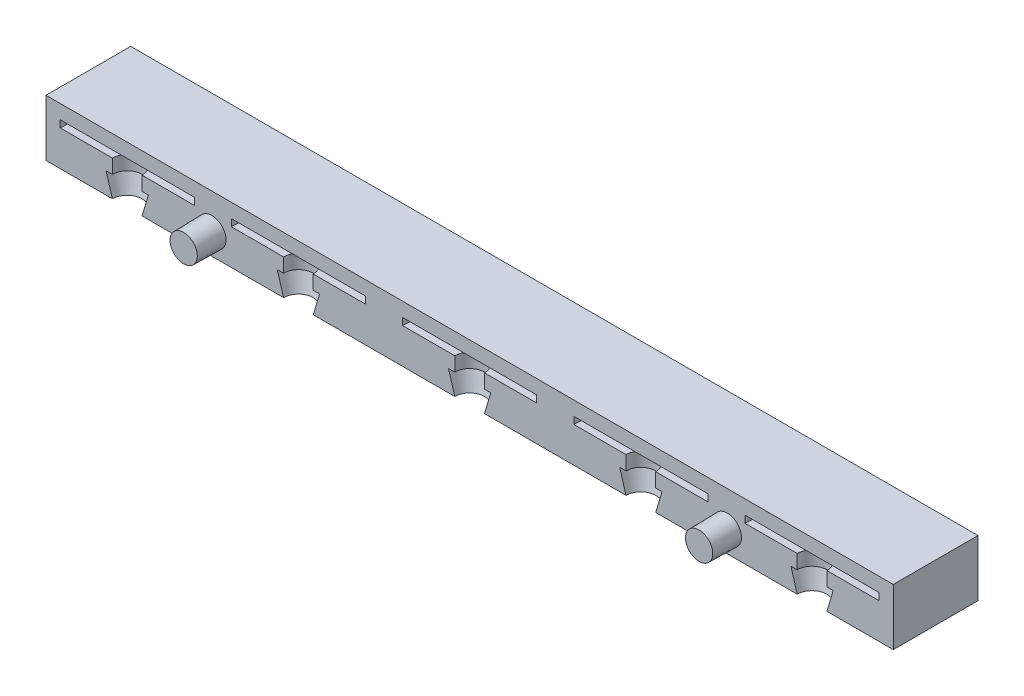
ISO-10303-21;
HEADER;
FILE_DESCRIPTION(('STEP AP214'),'2;1');
FILE_NAME('part.step','',(''),(''),'','','');
FILE_SCHEMA(('AUTOMOTIVE_DESIGN { 1 0 10303 214 1 1 1 1 }'));
ENDSEC;
DATA;
#1=APPLICATION_CONTEXT('core data for automotive mechanical design processes');
#2=APPLICATION_PROTOCOL_DEFINITION('international standard','automotive_design',2000,#1);
#3=PRODUCT_CONTEXT('',#1,'mechanical');
#4=PRODUCT('Part','Part','',(#3));
#5=PRODUCT_RELATED_PRODUCT_CATEGORY('part','',(#4));
#6=PRODUCT_DEFINITION_FORMATION('','',#4);
#7=PRODUCT_DEFINITION_CONTEXT('part definition',#1,'design');
#8=PRODUCT_DEFINITION('design','',#6,#7);
#9=PRODUCT_DEFINITION_SHAPE('','',#8);
#10=(LENGTH_UNIT() NAMED_UNIT(*) SI_UNIT(.MILLI.,.METRE.));
#11=(NAMED_UNIT(*) PLANE_ANGLE_UNIT() SI_UNIT($,.RADIAN.));
#12=(NAMED_UNIT(*) SI_UNIT($,.STERADIAN.) SOLID_ANGLE_UNIT());
#13=UNCERTAINTY_MEASURE_WITH_UNIT(LENGTH_MEASURE(1.E-05),#10,'distance_accuracy_value','');
#14=(GEOMETRIC_REPRESENTATION_CONTEXT(3) GLOBAL_UNCERTAINTY_ASSIGNED_CONTEXT((#13)) GLOBAL_UNIT_ASSIGNED_CONTEXT((#10,
#11,#12)) REPRESENTATION_CONTEXT('',''));
#15=CARTESIAN_POINT('',(0.,0.,0.));
#16=DIRECTION('',(0.,0.,1.));
#17=DIRECTION('',(1.,0.,0.));
#18=AXIS2_PLACEMENT_3D('',#15,#16,#17);
#19=CARTESIAN_POINT('',(0.,0.,-12.));
#20=DIRECTION('',(-1.,0.,0.));
#21=DIRECTION('',(0.,0.,1.));
#22=AXIS2_PLACEMENT_3D('',#19,#20,#21);
#23=PLANE('',#22);
#24=DIRECTION('',(0.,-1.,0.));
#25=VECTOR('',#24,1.);
#26=CARTESIAN_POINT('',(0.,0.,0.));
#27=LINE('',#26,#25);
#28=CARTESIAN_POINT('',(0.,8.,0.));
#29=VERTEX_POINT('',#28);
#30=CARTESIAN_POINT('',(0.,0.,0.));
#31=VERTEX_POINT('',#30);
#32=EDGE_CURVE('E326',#29,#31,#27,.T.);
#33=ORIENTED_EDGE('',*,*,#32,.F.);
#34=DIRECTION('',(0.,0.,1.));
#35=VECTOR('',#34,1.);
#36=CARTESIAN_POINT('',(0.,8.,-12.));
#37=LINE('',#36,#35);
#38=CARTESIAN_POINT('',(0.,8.,-12.));
#39=VERTEX_POINT('',#38);
#40=EDGE_CURVE('E329',#39,#29,#37,.T.);
#41=ORIENTED_EDGE('',*,*,#40,.F.);
#42=DIRECTION('',(0.,-1.,0.));
#43=VECTOR('',#42,1.);
#44=CARTESIAN_POINT('',(0.,0.,-12.));
#45=LINE('',#44,#43);
#46=CARTESIAN_POINT('',(0.,0.,-12.));
#47=VERTEX_POINT('',#46);
#48=EDGE_CURVE('E342',#39,#47,#45,.T.);
#49=ORIENTED_EDGE('',*,*,#48,.T.);
#50=DIRECTION('',(0.,0.,1.));
#51=VECTOR('',#50,1.);
#52=CARTESIAN_POINT('',(0.,0.,-12.));
#53=LINE('',#52,#51);
#54=EDGE_CURVE('E331',#47,#31,#53,.T.);
#55=ORIENTED_EDGE('',*,*,#54,.T.);
#56=EDGE_LOOP('',(#33,#41,#49,#55));
#57=FACE_BOUND('',#56,.T.);
#58=ADVANCED_FACE('F36',(#57),#23,.T.);
#59=CARTESIAN_POINT('',(0.,8.,-12.));
#60=DIRECTION('',(0.,1.,0.));
#61=DIRECTION('',(0.,0.,1.));
#62=AXIS2_PLACEMENT_3D('',#59,#60,#61);
#63=PLANE('',#62);
#64=DIRECTION('',(-1.,0.,0.));
#65=VECTOR('',#64,1.);
#66=CARTESIAN_POINT('',(0.,8.,0.));
#67=LINE('',#66,#65);
#68=CARTESIAN_POINT('',(120.,8.,0.));
#69=VERTEX_POINT('',#68);
#70=EDGE_CURVE('E339',#69,#29,#67,.T.);
#71=ORIENTED_EDGE('',*,*,#70,.F.);
#72=DIRECTION('',(0.,0.,1.));
#73=VECTOR('',#72,1.);
#74=CARTESIAN_POINT('',(120.,8.,-12.));
#75=LINE('',#74,#73);
#76=CARTESIAN_POINT('',(120.,8.,-12.));
#77=VERTEX_POINT('',#76);
#78=EDGE_CURVE('E352',#77,#69,#75,.T.);
#79=ORIENTED_EDGE('',*,*,#78,.F.);
#80=DIRECTION('',(-1.,0.,0.));
#81=VECTOR('',#80,1.);
#82=CARTESIAN_POINT('',(0.,8.,-12.));
#83=LINE('',#82,#81);
#84=EDGE_CURVE('E358',#77,#39,#83,.T.);
#85=ORIENTED_EDGE('',*,*,#84,.T.);
#86=ORIENTED_EDGE('',*,*,#40,.T.);
#87=EDGE_LOOP('',(#71,#79,#85,#86));
#88=FACE_BOUND('',#87,.T.);
#89=ADVANCED_FACE('F317',(#88),#63,.T.);
#90=CARTESIAN_POINT('',(120.,0.,-12.));
#91=DIRECTION('',(1.,0.,0.));
#92=DIRECTION('',(0.,0.,-1.));
#93=AXIS2_PLACEMENT_3D('',#90,#91,#92);
#94=PLANE('',#93);
#95=DIRECTION('',(0.,1.,0.));
#96=VECTOR('',#95,1.);
#97=CARTESIAN_POINT('',(120.,0.,0.));
#98=LINE('',#97,#96);
#99=CARTESIAN_POINT('',(120.,0.,0.));
#100=VERTEX_POINT('',#99);
#101=EDGE_CURVE('E341',#100,#69,#98,.T.);
#102=ORIENTED_EDGE('',*,*,#101,.F.);
#103=DIRECTION('',(0.,0.,1.));
#104=VECTOR('',#103,1.);
#105=CARTESIAN_POINT('',(120.,0.,-12.));
#106=LINE('',#105,#104);
#107=CARTESIAN_POINT('',(120.,0.,-12.));
#108=VERTEX_POINT('',#107);
#109=EDGE_CURVE('E354',#108,#100,#106,.T.);
#110=ORIENTED_EDGE('',*,*,#109,.F.);
#111=DIRECTION('',(0.,1.,0.));
#112=VECTOR('',#111,1.);
#113=CARTESIAN_POINT('',(120.,0.,-12.));
#114=LINE('',#113,#112);
#115=EDGE_CURVE('E547',#108,#77,#114,.T.);
#116=ORIENTED_EDGE('',*,*,#115,.T.);
#117=ORIENTED_EDGE('',*,*,#78,.T.);
#118=EDGE_LOOP('',(#102,#110,#116,#117));
#119=FACE_BOUND('',#118,.T.);
#120=ADVANCED_FACE('F322',(#119),#94,.T.);
#121=CARTESIAN_POINT('',(0.,0.,-12.));
#122=DIRECTION('',(0.,-1.,0.));
#123=DIRECTION('',(0.,0.,-1.));
#124=AXIS2_PLACEMENT_3D('',#121,#122,#123);
#125=PLANE('',#124);
#126=CARTESIAN_POINT('',(108.5,0.,0.));
#127=DIRECTION('',(0.,1.,0.));
#128=DIRECTION('',(-1.,0.,0.));
#129=AXIS2_PLACEMENT_3D('',#126,#127,#128);
#130=CIRCLE('',#129,2.1);
#131=CARTESIAN_POINT('',(110.6,0.,0.));
#132=VERTEX_POINT('',#131);
#133=CARTESIAN_POINT('',(106.4,0.,0.));
#134=VERTEX_POINT('',#133);
#135=EDGE_CURVE('E657',#132,#134,#130,.T.);
#136=ORIENTED_EDGE('',*,*,#135,.T.);
#137=DIRECTION('',(1.,0.,0.));
#138=VECTOR('',#137,1.);
#139=CARTESIAN_POINT('',(0.,0.,0.));
#140=LINE('',#139,#138);
#141=CARTESIAN_POINT('',(86.35,0.,0.));
#142=VERTEX_POINT('',#141);
#143=EDGE_CURVE('E487',#142,#134,#140,.T.);
#144=ORIENTED_EDGE('',*,*,#143,.F.);
#145=CARTESIAN_POINT('',(84.25,0.,0.));
#146=DIRECTION('',(0.,1.,0.));
#147=DIRECTION('',(-1.,0.,0.));
#148=AXIS2_PLACEMENT_3D('',#145,#146,#147);
#149=CIRCLE('',#148,2.1);
#150=CARTESIAN_POINT('',(82.15,0.,0.));
#151=VERTEX_POINT('',#150);
#152=EDGE_CURVE('E480',#142,#151,#149,.T.);
#153=ORIENTED_EDGE('',*,*,#152,.T.);
#154=CARTESIAN_POINT('',(62.1,0.,0.));
#155=VERTEX_POINT('',#154);
#156=EDGE_CURVE('E475',#155,#151,#140,.T.);
#157=ORIENTED_EDGE('',*,*,#156,.F.);
#158=CARTESIAN_POINT('',(60.,0.,0.));
#159=DIRECTION('',(0.,1.,0.));
#160=DIRECTION('',(-1.,0.,0.));
#161=AXIS2_PLACEMENT_3D('',#158,#159,#160);
#162=CIRCLE('',#161,2.1);
#163=CARTESIAN_POINT('',(57.9,0.,0.));
#164=VERTEX_POINT('',#163);
#165=EDGE_CURVE('E508',#155,#164,#162,.T.);
#166=ORIENTED_EDGE('',*,*,#165,.T.);
#167=CARTESIAN_POINT('',(37.85,0.,0.));
#168=VERTEX_POINT('',#167);
#169=EDGE_CURVE('E553',#168,#164,#140,.T.);
#170=ORIENTED_EDGE('',*,*,#169,.F.);
#171=CARTESIAN_POINT('',(35.75,0.,0.));
#172=DIRECTION('',(0.,1.,0.));
#173=DIRECTION('',(-1.,0.,0.));
#174=AXIS2_PLACEMENT_3D('',#171,#172,#173);
#175=CIRCLE('',#174,2.1);
#176=CARTESIAN_POINT('',(33.65,0.,0.));
#177=VERTEX_POINT('',#176);
#178=EDGE_CURVE('E525',#168,#177,#175,.T.);
#179=ORIENTED_EDGE('',*,*,#178,.T.);
#180=CARTESIAN_POINT('',(13.6,0.,0.));
#181=VERTEX_POINT('',#180);
#182=EDGE_CURVE('E551',#181,#177,#140,.T.);
#183=ORIENTED_EDGE('',*,*,#182,.F.);
#184=CARTESIAN_POINT('',(11.5,0.,0.));
#185=DIRECTION('',(0.,1.,0.));
#186=DIRECTION('',(-1.,0.,0.));
#187=AXIS2_PLACEMENT_3D('',#184,#185,#186);
#188=CIRCLE('',#187,2.1);
#189=CARTESIAN_POINT('',(9.4,0.,0.));
#190=VERTEX_POINT('',#189);
#191=EDGE_CURVE('E335',#181,#190,#188,.T.);
#192=ORIENTED_EDGE('',*,*,#191,.T.);
#193=EDGE_CURVE('E346',#31,#190,#140,.T.);
#194=ORIENTED_EDGE('',*,*,#193,.F.);
#195=ORIENTED_EDGE('',*,*,#54,.F.);
#196=DIRECTION('',(1.,0.,0.));
#197=VECTOR('',#196,1.);
#198=CARTESIAN_POINT('',(0.,0.,-12.));
#199=LINE('',#198,#197);
#200=EDGE_CURVE('E344',#47,#108,#199,.T.);
#201=ORIENTED_EDGE('',*,*,#200,.T.);
#202=ORIENTED_EDGE('',*,*,#109,.T.);
#203=EDGE_CURVE('E334',#132,#100,#140,.T.);
#204=ORIENTED_EDGE('',*,*,#203,.F.);
#205=EDGE_LOOP('',(#136,#144,#153,#157,#166,#170,#179,#183,#192,#194,#195,#201,#202,#204));
#206=FACE_BOUND('',#205,.T.);
#207=ADVANCED_FACE('F311',(#206),#125,.T.);
#208=CARTESIAN_POINT('',(0.,0.,-12.));
#209=DIRECTION('',(0.,0.,-1.));
#210=DIRECTION('',(-1.,0.,0.));
#211=AXIS2_PLACEMENT_3D('',#208,#209,#210);
#212=PLANE('',#211);
#213=ORIENTED_EDGE('',*,*,#48,.F.);
#214=ORIENTED_EDGE('',*,*,#84,.F.);
#215=ORIENTED_EDGE('',*,*,#115,.F.);
#216=ORIENTED_EDGE('',*,*,#200,.F.);
#217=EDGE_LOOP('',(#213,#214,#215,#216));
#218=FACE_BOUND('',#217,.T.);
#219=ADVANCED_FACE('F301',(#218),#212,.T.);
#220=CARTESIAN_POINT('',(0.,0.,0.));
#221=DIRECTION('',(0.,0.,-1.));
#222=DIRECTION('',(-1.,0.,0.));
#223=AXIS2_PLACEMENT_3D('',#220,#221,#222);
#224=PLANE('',#223);
#225=CARTESIAN_POINT('',(96.5,3.,0.));
#226=DIRECTION('',(0.,0.,-1.));
#227=DIRECTION('',(-1.,0.,0.));
#228=AXIS2_PLACEMENT_3D('',#225,#226,#227);
#229=CIRCLE('',#228,2.);
#230=CARTESIAN_POINT('',(94.5,3.,0.));
#231=VERTEX_POINT('',#230);
#232=EDGE_CURVE('E12',#231,#231,#229,.F.);
#233=ORIENTED_EDGE('',*,*,#232,.F.);
#234=EDGE_LOOP('',(#233));
#235=FACE_BOUND('',#234,.T.);
#236=CARTESIAN_POINT('',(23.5,3.,0.));
#237=DIRECTION('',(0.,0.,-1.));
#238=DIRECTION('',(-1.,0.,0.));
#239=AXIS2_PLACEMENT_3D('',#236,#237,#238);
#240=CIRCLE('',#239,2.);
#241=CARTESIAN_POINT('',(21.5,3.,0.));
#242=VERTEX_POINT('',#241);
#243=EDGE_CURVE('E43',#242,#242,#240,.F.);
#244=ORIENTED_EDGE('',*,*,#243,.F.);
#245=EDGE_LOOP('',(#244));
#246=FACE_BOUND('',#245,.T.);
#247=ORIENTED_EDGE('',*,*,#143,.T.);
#248=DIRECTION('',(-0.287347885566345,0.957826285221151,0.));
#249=VECTOR('',#248,1.);
#250=CARTESIAN_POINT('',(108.5,-7.00000000000002,0.));
#251=LINE('',#250,#249);
#252=CARTESIAN_POINT('',(105.5,3.,0.));
#253=VERTEX_POINT('',#252);
#254=EDGE_CURVE('E292',#134,#253,#251,.T.);
#255=ORIENTED_EDGE('',*,*,#254,.T.);
#256=DIRECTION('',(1.,0.,0.));
#257=VECTOR('',#256,1.);
#258=CARTESIAN_POINT('',(0.,2.99999999999997,0.));
#259=LINE('',#258,#257);
#260=CARTESIAN_POINT('',(106.4,3.,0.));
#261=VERTEX_POINT('',#260);
#262=EDGE_CURVE('E288',#253,#261,#259,.T.);
#263=ORIENTED_EDGE('',*,*,#262,.T.);
#264=DIRECTION('',(0.,1.,0.));
#265=VECTOR('',#264,1.);
#266=CARTESIAN_POINT('',(106.4,6.,0.));
#267=LINE('',#266,#265);
#268=CARTESIAN_POINT('',(106.4,5.,0.));
#269=VERTEX_POINT('',#268);
#270=EDGE_CURVE('E283',#261,#269,#267,.T.);
#271=ORIENTED_EDGE('',*,*,#270,.T.);
#272=DIRECTION('',(-1.,0.,0.));
#273=VECTOR('',#272,1.);
#274=CARTESIAN_POINT('',(0.,4.99999999999997,0.));
#275=LINE('',#274,#273);
#276=CARTESIAN_POINT('',(99.,4.99999999999999,0.));
#277=VERTEX_POINT('',#276);
#278=EDGE_CURVE('E274',#269,#277,#275,.T.);
#279=ORIENTED_EDGE('',*,*,#278,.T.);
#280=DIRECTION('',(0.,1.,0.));
#281=VECTOR('',#280,1.);
#282=CARTESIAN_POINT('',(99.,6.,0.));
#283=LINE('',#282,#281);
#284=CARTESIAN_POINT('',(99.,6.,0.));
#285=VERTEX_POINT('',#284);
#286=EDGE_CURVE('E265',#277,#285,#283,.T.);
#287=ORIENTED_EDGE('',*,*,#286,.T.);
#288=DIRECTION('',(1.,0.,0.));
#289=VECTOR('',#288,1.);
#290=CARTESIAN_POINT('',(0.,5.99999999999997,0.));
#291=LINE('',#290,#289);
#292=CARTESIAN_POINT('',(118.,6.,0.));
#293=VERTEX_POINT('',#292);
#294=EDGE_CURVE('E254',#285,#293,#291,.T.);
#295=ORIENTED_EDGE('',*,*,#294,.T.);
#296=DIRECTION('',(0.,1.,0.));
#297=VECTOR('',#296,1.);
#298=CARTESIAN_POINT('',(118.,6.,0.));
#299=LINE('',#298,#297);
#300=CARTESIAN_POINT('',(118.,5.,0.));
#301=VERTEX_POINT('',#300);
#302=EDGE_CURVE('E259',#293,#301,#299,.F.);
#303=ORIENTED_EDGE('',*,*,#302,.T.);
#304=CARTESIAN_POINT('',(110.6,5.,0.));
#305=VERTEX_POINT('',#304);
#306=EDGE_CURVE('E276',#301,#305,#275,.T.);
#307=ORIENTED_EDGE('',*,*,#306,.T.);
#308=DIRECTION('',(0.,1.,0.));
#309=VECTOR('',#308,1.);
#310=CARTESIAN_POINT('',(110.6,6.,0.));
#311=LINE('',#310,#309);
#312=CARTESIAN_POINT('',(110.6,3.,0.));
#313=VERTEX_POINT('',#312);
#314=EDGE_CURVE('E280',#305,#313,#311,.F.);
#315=ORIENTED_EDGE('',*,*,#314,.T.);
#316=CARTESIAN_POINT('',(111.5,3.,0.));
#317=VERTEX_POINT('',#316);
#318=EDGE_CURVE('E285',#313,#317,#259,.T.);
#319=ORIENTED_EDGE('',*,*,#318,.T.);
#320=DIRECTION('',(-0.287347885566345,-0.957826285221152,0.));
#321=VECTOR('',#320,1.);
#322=CARTESIAN_POINT('',(108.5,-7.00000000000002,0.));
#323=LINE('',#322,#321);
#324=EDGE_CURVE('E289',#317,#132,#323,.T.);
#325=ORIENTED_EDGE('',*,*,#324,.T.);
#326=ORIENTED_EDGE('',*,*,#203,.T.);
#327=ORIENTED_EDGE('',*,*,#101,.T.);
#328=ORIENTED_EDGE('',*,*,#70,.T.);
#329=ORIENTED_EDGE('',*,*,#32,.T.);
#330=ORIENTED_EDGE('',*,*,#193,.T.);
#331=DIRECTION('',(-0.287347885566345,0.957826285221151,0.));
#332=VECTOR('',#331,1.);
#333=CARTESIAN_POINT('',(11.5,-7.00000000000002,0.));
#334=LINE('',#333,#332);
#335=CARTESIAN_POINT('',(8.5,3.,0.));
#336=VERTEX_POINT('',#335);
#337=EDGE_CURVE('E384',#190,#336,#334,.T.);
#338=ORIENTED_EDGE('',*,*,#337,.T.);
#339=DIRECTION('',(1.,0.,0.));
#340=VECTOR('',#339,1.);
#341=CARTESIAN_POINT('',(0.,3.,0.));
#342=LINE('',#341,#340);
#343=CARTESIAN_POINT('',(9.4,3.,0.));
#344=VERTEX_POINT('',#343);
#345=EDGE_CURVE('E380',#336,#344,#342,.T.);
#346=ORIENTED_EDGE('',*,*,#345,.T.);
#347=DIRECTION('',(0.,1.,0.));
#348=VECTOR('',#347,1.);
#349=CARTESIAN_POINT('',(9.4,6.,0.));
#350=LINE('',#349,#348);
#351=CARTESIAN_POINT('',(9.4,5.,0.));
#352=VERTEX_POINT('',#351);
#353=EDGE_CURVE('E374',#344,#352,#350,.T.);
#354=ORIENTED_EDGE('',*,*,#353,.T.);
#355=DIRECTION('',(-1.,0.,0.));
#356=VECTOR('',#355,1.);
#357=CARTESIAN_POINT('',(0.,4.99999999999999,0.));
#358=LINE('',#357,#356);
#359=CARTESIAN_POINT('',(2.,4.99999999999999,0.));
#360=VERTEX_POINT('',#359);
#361=EDGE_CURVE('E367',#352,#360,#358,.T.);
#362=ORIENTED_EDGE('',*,*,#361,.T.);
#363=DIRECTION('',(0.,1.,0.));
#364=VECTOR('',#363,1.);
#365=CARTESIAN_POINT('',(2.,5.99999999999999,0.));
#366=LINE('',#365,#364);
#367=CARTESIAN_POINT('',(2.,6.,0.));
#368=VERTEX_POINT('',#367);
#369=EDGE_CURVE('E364',#360,#368,#366,.T.);
#370=ORIENTED_EDGE('',*,*,#369,.T.);
#371=DIRECTION('',(1.,0.,0.));
#372=VECTOR('',#371,1.);
#373=CARTESIAN_POINT('',(0.,5.99999999999999,0.));
#374=LINE('',#373,#372);
#375=CARTESIAN_POINT('',(21.,6.,0.));
#376=VERTEX_POINT('',#375);
#377=EDGE_CURVE('E351',#368,#376,#374,.T.);
#378=ORIENTED_EDGE('',*,*,#377,.T.);
#379=DIRECTION('',(0.,1.,0.));
#380=VECTOR('',#379,1.);
#381=CARTESIAN_POINT('',(21.,6.,0.));
#382=LINE('',#381,#380);
#383=CARTESIAN_POINT('',(21.,5.,0.));
#384=VERTEX_POINT('',#383);
#385=EDGE_CURVE('E361',#376,#384,#382,.F.);
#386=ORIENTED_EDGE('',*,*,#385,.T.);
#387=CARTESIAN_POINT('',(13.6,5.,0.));
#388=VERTEX_POINT('',#387);
#389=EDGE_CURVE('E370',#384,#388,#358,.T.);
#390=ORIENTED_EDGE('',*,*,#389,.T.);
#391=DIRECTION('',(0.,1.,0.));
#392=VECTOR('',#391,1.);
#393=CARTESIAN_POINT('',(13.6,6.,0.));
#394=LINE('',#393,#392);
#395=CARTESIAN_POINT('',(13.6,3.,0.));
#396=VERTEX_POINT('',#395);
#397=EDGE_CURVE('E371',#388,#396,#394,.F.);
#398=ORIENTED_EDGE('',*,*,#397,.T.);
#399=CARTESIAN_POINT('',(14.5,3.,0.));
#400=VERTEX_POINT('',#399);
#401=EDGE_CURVE('E377',#396,#400,#342,.T.);
#402=ORIENTED_EDGE('',*,*,#401,.T.);
#403=DIRECTION('',(-0.287347885566345,-0.957826285221152,0.));
#404=VECTOR('',#403,1.);
#405=CARTESIAN_POINT('',(11.5,-7.00000000000002,0.));
#406=LINE('',#405,#404);
#407=EDGE_CURVE('E381',#400,#181,#406,.T.);
#408=ORIENTED_EDGE('',*,*,#407,.T.);
#409=ORIENTED_EDGE('',*,*,#182,.T.);
#410=DIRECTION('',(-0.287347885566345,0.957826285221151,0.));
#411=VECTOR('',#410,1.);
#412=CARTESIAN_POINT('',(35.75,-7.00000000000002,0.));
#413=LINE('',#412,#411);
#414=CARTESIAN_POINT('',(32.75,3.,0.));
#415=VERTEX_POINT('',#414);
#416=EDGE_CURVE('E413',#177,#415,#413,.T.);
#417=ORIENTED_EDGE('',*,*,#416,.T.);
#418=DIRECTION('',(1.,0.,0.));
#419=VECTOR('',#418,1.);
#420=CARTESIAN_POINT('',(0.,2.99999999999999,0.));
#421=LINE('',#420,#419);
#422=CARTESIAN_POINT('',(33.65,3.,0.));
#423=VERTEX_POINT('',#422);
#424=EDGE_CURVE('E409',#415,#423,#421,.T.);
#425=ORIENTED_EDGE('',*,*,#424,.T.);
#426=DIRECTION('',(0.,1.,0.));
#427=VECTOR('',#426,1.);
#428=CARTESIAN_POINT('',(33.65,6.,0.));
#429=LINE('',#428,#427);
#430=CARTESIAN_POINT('',(33.65,5.,0.));
#431=VERTEX_POINT('',#430);
#432=EDGE_CURVE('E403',#423,#431,#429,.T.);
#433=ORIENTED_EDGE('',*,*,#432,.T.);
#434=DIRECTION('',(-1.,0.,0.));
#435=VECTOR('',#434,1.);
#436=CARTESIAN_POINT('',(0.,4.99999999999999,0.));
#437=LINE('',#436,#435);
#438=CARTESIAN_POINT('',(26.25,4.99999999999999,0.));
#439=VERTEX_POINT('',#438);
#440=EDGE_CURVE('E396',#431,#439,#437,.T.);
#441=ORIENTED_EDGE('',*,*,#440,.T.);
#442=DIRECTION('',(0.,1.,0.));
#443=VECTOR('',#442,1.);
#444=CARTESIAN_POINT('',(26.25,5.99999999999999,0.));
#445=LINE('',#444,#443);
#446=CARTESIAN_POINT('',(26.25,6.,0.));
#447=VERTEX_POINT('',#446);
#448=EDGE_CURVE('E393',#439,#447,#445,.T.);
#449=ORIENTED_EDGE('',*,*,#448,.T.);
#450=DIRECTION('',(1.,0.,0.));
#451=VECTOR('',#450,1.);
#452=CARTESIAN_POINT('',(0.,5.99999999999999,0.));
#453=LINE('',#452,#451);
#454=CARTESIAN_POINT('',(45.25,6.,0.));
#455=VERTEX_POINT('',#454);
#456=EDGE_CURVE('E387',#447,#455,#453,.T.);
#457=ORIENTED_EDGE('',*,*,#456,.T.);
#458=DIRECTION('',(0.,1.,0.));
#459=VECTOR('',#458,1.);
#460=CARTESIAN_POINT('',(45.25,6.,0.));
#461=LINE('',#460,#459);
#462=CARTESIAN_POINT('',(45.25,5.,0.));
#463=VERTEX_POINT('',#462);
#464=EDGE_CURVE('E390',#455,#463,#461,.F.);
#465=ORIENTED_EDGE('',*,*,#464,.T.);
#466=CARTESIAN_POINT('',(37.85,5.,0.));
#467=VERTEX_POINT('',#466);
#468=EDGE_CURVE('E399',#463,#467,#437,.T.);
#469=ORIENTED_EDGE('',*,*,#468,.T.);
#470=DIRECTION('',(0.,1.,0.));
#471=VECTOR('',#470,1.);
#472=CARTESIAN_POINT('',(37.85,6.,0.));
#473=LINE('',#472,#471);
#474=CARTESIAN_POINT('',(37.85,3.,0.));
#475=VERTEX_POINT('',#474);
#476=EDGE_CURVE('E400',#467,#475,#473,.F.);
#477=ORIENTED_EDGE('',*,*,#476,.T.);
#478=CARTESIAN_POINT('',(38.75,3.,0.));
#479=VERTEX_POINT('',#478);
#480=EDGE_CURVE('E406',#475,#479,#421,.T.);
#481=ORIENTED_EDGE('',*,*,#480,.T.);
#482=DIRECTION('',(-0.287347885566345,-0.957826285221152,0.));
#483=VECTOR('',#482,1.);
#484=CARTESIAN_POINT('',(35.75,-7.00000000000002,0.));
#485=LINE('',#484,#483);
#486=EDGE_CURVE('E410',#479,#168,#485,.T.);
#487=ORIENTED_EDGE('',*,*,#486,.T.);
#488=ORIENTED_EDGE('',*,*,#169,.T.);
#489=DIRECTION('',(-0.287347885566345,0.957826285221151,0.));
#490=VECTOR('',#489,1.);
#491=CARTESIAN_POINT('',(60.,-7.00000000000002,0.));
#492=LINE('',#491,#490);
#493=CARTESIAN_POINT('',(57.,3.,0.));
#494=VERTEX_POINT('',#493);
#495=EDGE_CURVE('E442',#164,#494,#492,.T.);
#496=ORIENTED_EDGE('',*,*,#495,.T.);
#497=DIRECTION('',(1.,0.,0.));
#498=VECTOR('',#497,1.);
#499=CARTESIAN_POINT('',(0.,2.99999999999998,0.));
#500=LINE('',#499,#498);
#501=CARTESIAN_POINT('',(57.9,3.,0.));
#502=VERTEX_POINT('',#501);
#503=EDGE_CURVE('E438',#494,#502,#500,.T.);
#504=ORIENTED_EDGE('',*,*,#503,.T.);
#505=DIRECTION('',(0.,1.,0.));
#506=VECTOR('',#505,1.);
#507=CARTESIAN_POINT('',(57.9,6.,0.));
#508=LINE('',#507,#506);
#509=CARTESIAN_POINT('',(57.9,5.,0.));
#510=VERTEX_POINT('',#509);
#511=EDGE_CURVE('E432',#502,#510,#508,.T.);
#512=ORIENTED_EDGE('',*,*,#511,.T.);
#513=DIRECTION('',(-1.,0.,0.));
#514=VECTOR('',#513,1.);
#515=CARTESIAN_POINT('',(0.,4.99999999999998,0.));
#516=LINE('',#515,#514);
#517=CARTESIAN_POINT('',(50.5,4.99999999999999,0.));
#518=VERTEX_POINT('',#517);
#519=EDGE_CURVE('E425',#510,#518,#516,.T.);
#520=ORIENTED_EDGE('',*,*,#519,.T.);
#521=DIRECTION('',(0.,1.,0.));
#522=VECTOR('',#521,1.);
#523=CARTESIAN_POINT('',(50.5,6.,0.));
#524=LINE('',#523,#522);
#525=CARTESIAN_POINT('',(50.5,6.,0.));
#526=VERTEX_POINT('',#525);
#527=EDGE_CURVE('E422',#518,#526,#524,.T.);
#528=ORIENTED_EDGE('',*,*,#527,.T.);
#529=DIRECTION('',(1.,0.,0.));
#530=VECTOR('',#529,1.);
#531=CARTESIAN_POINT('',(0.,5.99999999999998,0.));
#532=LINE('',#531,#530);
#533=CARTESIAN_POINT('',(69.5,6.,0.));
#534=VERTEX_POINT('',#533);
#535=EDGE_CURVE('E416',#526,#534,#532,.T.);
#536=ORIENTED_EDGE('',*,*,#535,.T.);
#537=DIRECTION('',(0.,1.,0.));
#538=VECTOR('',#537,1.);
#539=CARTESIAN_POINT('',(69.5,6.,0.));
#540=LINE('',#539,#538);
#541=CARTESIAN_POINT('',(69.5,5.,0.));
#542=VERTEX_POINT('',#541);
#543=EDGE_CURVE('E419',#534,#542,#540,.F.);
#544=ORIENTED_EDGE('',*,*,#543,.T.);
#545=CARTESIAN_POINT('',(62.1,5.,0.));
#546=VERTEX_POINT('',#545);
#547=EDGE_CURVE('E428',#542,#546,#516,.T.);
#548=ORIENTED_EDGE('',*,*,#547,.T.);
#549=DIRECTION('',(0.,1.,0.));
#550=VECTOR('',#549,1.);
#551=CARTESIAN_POINT('',(62.1,6.,0.));
#552=LINE('',#551,#550);
#553=CARTESIAN_POINT('',(62.1,3.,0.));
#554=VERTEX_POINT('',#553);
#555=EDGE_CURVE('E429',#546,#554,#552,.F.);
#556=ORIENTED_EDGE('',*,*,#555,.T.);
#557=CARTESIAN_POINT('',(63.,3.,0.));
#558=VERTEX_POINT('',#557);
#559=EDGE_CURVE('E435',#554,#558,#500,.T.);
#560=ORIENTED_EDGE('',*,*,#559,.T.);
#561=DIRECTION('',(-0.287347885566345,-0.957826285221152,0.));
#562=VECTOR('',#561,1.);
#563=CARTESIAN_POINT('',(60.,-7.00000000000002,0.));
#564=LINE('',#563,#562);
#565=EDGE_CURVE('E439',#558,#155,#564,.T.);
#566=ORIENTED_EDGE('',*,*,#565,.T.);
#567=ORIENTED_EDGE('',*,*,#156,.T.);
#568=DIRECTION('',(-0.287347885566345,0.957826285221151,0.));
#569=VECTOR('',#568,1.);
#570=CARTESIAN_POINT('',(84.25,-7.00000000000002,0.));
#571=LINE('',#570,#569);
#572=CARTESIAN_POINT('',(81.25,3.,0.));
#573=VERTEX_POINT('',#572);
#574=EDGE_CURVE('E260',#151,#573,#571,.T.);
#575=ORIENTED_EDGE('',*,*,#574,.T.);
#576=DIRECTION('',(1.,0.,0.));
#577=VECTOR('',#576,1.);
#578=CARTESIAN_POINT('',(0.,2.99999999999998,0.));
#579=LINE('',#578,#577);
#580=CARTESIAN_POINT('',(82.15,3.,0.));
#581=VERTEX_POINT('',#580);
#582=EDGE_CURVE('E467',#573,#581,#579,.T.);
#583=ORIENTED_EDGE('',*,*,#582,.T.);
#584=DIRECTION('',(0.,1.,0.));
#585=VECTOR('',#584,1.);
#586=CARTESIAN_POINT('',(82.15,6.,0.));
#587=LINE('',#586,#585);
#588=CARTESIAN_POINT('',(82.15,5.,0.));
#589=VERTEX_POINT('',#588);
#590=EDGE_CURVE('E461',#581,#589,#587,.T.);
#591=ORIENTED_EDGE('',*,*,#590,.T.);
#592=DIRECTION('',(-1.,0.,0.));
#593=VECTOR('',#592,1.);
#594=CARTESIAN_POINT('',(0.,4.99999999999998,0.));
#595=LINE('',#594,#593);
#596=CARTESIAN_POINT('',(74.75,4.99999999999999,0.));
#597=VERTEX_POINT('',#596);
#598=EDGE_CURVE('E454',#589,#597,#595,.T.);
#599=ORIENTED_EDGE('',*,*,#598,.T.);
#600=DIRECTION('',(0.,1.,0.));
#601=VECTOR('',#600,1.);
#602=CARTESIAN_POINT('',(74.75,6.,0.));
#603=LINE('',#602,#601);
#604=CARTESIAN_POINT('',(74.75,6.,0.));
#605=VERTEX_POINT('',#604);
#606=EDGE_CURVE('E451',#597,#605,#603,.T.);
#607=ORIENTED_EDGE('',*,*,#606,.T.);
#608=DIRECTION('',(1.,0.,0.));
#609=VECTOR('',#608,1.);
#610=CARTESIAN_POINT('',(0.,5.99999999999998,0.));
#611=LINE('',#610,#609);
#612=CARTESIAN_POINT('',(93.75,6.,0.));
#613=VERTEX_POINT('',#612);
#614=EDGE_CURVE('E445',#605,#613,#611,.T.);
#615=ORIENTED_EDGE('',*,*,#614,.T.);
#616=DIRECTION('',(0.,1.,0.));
#617=VECTOR('',#616,1.);
#618=CARTESIAN_POINT('',(93.75,6.,0.));
#619=LINE('',#618,#617);
#620=CARTESIAN_POINT('',(93.75,5.,0.));
#621=VERTEX_POINT('',#620);
#622=EDGE_CURVE('E448',#613,#621,#619,.F.);
#623=ORIENTED_EDGE('',*,*,#622,.T.);
#624=CARTESIAN_POINT('',(86.35,5.,0.));
#625=VERTEX_POINT('',#624);
#626=EDGE_CURVE('E457',#621,#625,#595,.T.);
#627=ORIENTED_EDGE('',*,*,#626,.T.);
#628=DIRECTION('',(0.,1.,0.));
#629=VECTOR('',#628,1.);
#630=CARTESIAN_POINT('',(86.35,6.,0.));
#631=LINE('',#630,#629);
#632=CARTESIAN_POINT('',(86.35,3.,0.));
#633=VERTEX_POINT('',#632);
#634=EDGE_CURVE('E458',#625,#633,#631,.F.);
#635=ORIENTED_EDGE('',*,*,#634,.T.);
#636=CARTESIAN_POINT('',(87.25,3.,0.));
#637=VERTEX_POINT('',#636);
#638=EDGE_CURVE('E464',#633,#637,#579,.T.);
#639=ORIENTED_EDGE('',*,*,#638,.T.);
#640=DIRECTION('',(-0.287347885566345,-0.957826285221152,0.));
#641=VECTOR('',#640,1.);
#642=CARTESIAN_POINT('',(84.25,-7.00000000000002,0.));
#643=LINE('',#642,#641);
#644=EDGE_CURVE('E468',#637,#142,#643,.T.);
#645=ORIENTED_EDGE('',*,*,#644,.T.);
#646=EDGE_LOOP('',(#247,#255,#263,#271,#279,#287,#295,#303,#307,#315,#319,#325,#326,#327,#328,
#329,#330,#338,#346,#354,#362,#370,#378,#386,#390,#398,#402,#408,#409,#417,#425,#433,#441,#449,
#457,#465,#469,#477,#481,#487,#488,#496,#504,#512,#520,#528,#536,#544,#548,#556,#560,#566,#567,
#575,#583,#591,#599,#607,#615,#623,#627,#635,#639,#645));
#647=FACE_BOUND('',#646,.T.);
#648=ADVANCED_FACE('F272',(#235,#246,#647),#224,.F.);
#649=CARTESIAN_POINT('',(11.5,3.,0.));
#650=DIRECTION('',(0.,1.,0.));
#651=DIRECTION('',(-1.,0.,0.));
#652=AXIS2_PLACEMENT_3D('',#649,#650,#651);
#653=CONICAL_SURFACE('',#652,3.,0.291456794477867);
#654=ORIENTED_EDGE('',*,*,#191,.F.);
#655=ORIENTED_EDGE('',*,*,#407,.F.);
#656=CARTESIAN_POINT('',(11.5,3.,0.));
#657=DIRECTION('',(0.,1.,0.));
#658=DIRECTION('',(-1.,0.,0.));
#659=AXIS2_PLACEMENT_3D('',#656,#657,#658);
#660=CIRCLE('',#659,3.);
#661=EDGE_CURVE('E540',#400,#336,#660,.T.);
#662=ORIENTED_EDGE('',*,*,#661,.T.);
#663=ORIENTED_EDGE('',*,*,#337,.F.);
#664=EDGE_LOOP('',(#654,#655,#662,#663));
#665=FACE_BOUND('',#664,.T.);
#666=ADVANCED_FACE('F300',(#665),#653,.F.);
#667=CARTESIAN_POINT('',(8.5,3.,0.));
#668=DIRECTION('',(0.,1.,0.));
#669=DIRECTION('',(-1.,0.,0.));
#670=AXIS2_PLACEMENT_3D('',#667,#668,#669);
#671=PLANE('',#670);
#672=ORIENTED_EDGE('',*,*,#661,.F.);
#673=ORIENTED_EDGE('',*,*,#401,.F.);
#674=CARTESIAN_POINT('',(11.5,3.,0.));
#675=DIRECTION('',(0.,1.,0.));
#676=DIRECTION('',(-1.,0.,0.));
#677=AXIS2_PLACEMENT_3D('',#674,#675,#676);
#678=CIRCLE('',#677,2.1);
#679=EDGE_CURVE('E537',#396,#344,#678,.T.);
#680=ORIENTED_EDGE('',*,*,#679,.T.);
#681=ORIENTED_EDGE('',*,*,#345,.F.);
#682=EDGE_LOOP('',(#672,#673,#680,#681));
#683=FACE_BOUND('',#682,.T.);
#684=ADVANCED_FACE('F308',(#683),#671,.F.);
#685=CARTESIAN_POINT('',(11.5,6.,0.));
#686=DIRECTION('',(0.,1.,0.));
#687=DIRECTION('',(-1.,0.,0.));
#688=AXIS2_PLACEMENT_3D('',#685,#686,#687);
#689=CYLINDRICAL_SURFACE('',#688,2.1);
#690=ORIENTED_EDGE('',*,*,#679,.F.);
#691=ORIENTED_EDGE('',*,*,#397,.F.);
#692=CARTESIAN_POINT('',(11.5,5.,0.));
#693=DIRECTION('',(0.,1.,0.));
#694=DIRECTION('',(-1.,0.,0.));
#695=AXIS2_PLACEMENT_3D('',#692,#693,#694);
#696=CIRCLE('',#695,2.1);
#697=EDGE_CURVE('E534',#388,#352,#696,.T.);
#698=ORIENTED_EDGE('',*,*,#697,.T.);
#699=ORIENTED_EDGE('',*,*,#353,.F.);
#700=EDGE_LOOP('',(#690,#691,#698,#699));
#701=FACE_BOUND('',#700,.T.);
#702=ADVANCED_FACE('F631',(#701),#689,.F.);
#703=CARTESIAN_POINT('',(9.4,5.,0.));
#704=DIRECTION('',(0.,-1.,0.));
#705=DIRECTION('',(1.,0.,0.));
#706=AXIS2_PLACEMENT_3D('',#703,#704,#705);
#707=PLANE('',#706);
#708=CARTESIAN_POINT('',(11.5,4.99999999999999,0.));
#709=DIRECTION('',(0.,1.,0.));
#710=DIRECTION('',(-1.,0.,0.));
#711=AXIS2_PLACEMENT_3D('',#708,#709,#710);
#712=CIRCLE('',#711,9.5);
#713=EDGE_CURVE('E531',#384,#360,#712,.T.);
#714=ORIENTED_EDGE('',*,*,#713,.T.);
#715=ORIENTED_EDGE('',*,*,#361,.F.);
#716=ORIENTED_EDGE('',*,*,#697,.F.);
#717=ORIENTED_EDGE('',*,*,#389,.F.);
#718=EDGE_LOOP('',(#714,#715,#716,#717));
#719=FACE_BOUND('',#718,.T.);
#720=ADVANCED_FACE('F627',(#719),#707,.F.);
#721=CARTESIAN_POINT('',(11.5,6.,0.));
#722=DIRECTION('',(0.,1.,0.));
#723=DIRECTION('',(-1.,0.,0.));
#724=AXIS2_PLACEMENT_3D('',#721,#722,#723);
#725=CYLINDRICAL_SURFACE('',#724,9.5);
#726=ORIENTED_EDGE('',*,*,#713,.F.);
#727=ORIENTED_EDGE('',*,*,#385,.F.);
#728=CARTESIAN_POINT('',(11.5,6.,0.));
#729=DIRECTION('',(0.,1.,0.));
#730=DIRECTION('',(-1.,0.,0.));
#731=AXIS2_PLACEMENT_3D('',#728,#729,#730);
#732=CIRCLE('',#731,9.5);
#733=EDGE_CURVE('E528',#376,#368,#732,.T.);
#734=ORIENTED_EDGE('',*,*,#733,.T.);
#735=ORIENTED_EDGE('',*,*,#369,.F.);
#736=EDGE_LOOP('',(#726,#727,#734,#735));
#737=FACE_BOUND('',#736,.T.);
#738=ADVANCED_FACE('F623',(#737),#725,.F.);
#739=CARTESIAN_POINT('',(2.,6.,0.));
#740=DIRECTION('',(0.,1.,0.));
#741=DIRECTION('',(-1.,0.,0.));
#742=AXIS2_PLACEMENT_3D('',#739,#740,#741);
#743=PLANE('',#742);
#744=ORIENTED_EDGE('',*,*,#733,.F.);
#745=ORIENTED_EDGE('',*,*,#377,.F.);
#746=EDGE_LOOP('',(#744,#745));
#747=FACE_BOUND('',#746,.T.);
#748=ADVANCED_FACE('F619',(#747),#743,.F.);
#749=CARTESIAN_POINT('',(35.75,3.,0.));
#750=DIRECTION('',(0.,1.,0.));
#751=DIRECTION('',(-1.,0.,0.));
#752=AXIS2_PLACEMENT_3D('',#749,#750,#751);
#753=CONICAL_SURFACE('',#752,3.,0.291456794477867);
#754=ORIENTED_EDGE('',*,*,#178,.F.);
#755=ORIENTED_EDGE('',*,*,#486,.F.);
#756=CARTESIAN_POINT('',(35.75,3.,0.));
#757=DIRECTION('',(0.,1.,0.));
#758=DIRECTION('',(-1.,0.,0.));
#759=AXIS2_PLACEMENT_3D('',#756,#757,#758);
#760=CIRCLE('',#759,3.);
#761=EDGE_CURVE('E522',#479,#415,#760,.T.);
#762=ORIENTED_EDGE('',*,*,#761,.T.);
#763=ORIENTED_EDGE('',*,*,#416,.F.);
#764=EDGE_LOOP('',(#754,#755,#762,#763));
#765=FACE_BOUND('',#764,.T.);
#766=ADVANCED_FACE('F615',(#765),#753,.F.);
#767=CARTESIAN_POINT('',(32.75,3.,0.));
#768=DIRECTION('',(0.,1.,0.));
#769=DIRECTION('',(-1.,0.,0.));
#770=AXIS2_PLACEMENT_3D('',#767,#768,#769);
#771=PLANE('',#770);
#772=ORIENTED_EDGE('',*,*,#761,.F.);
#773=ORIENTED_EDGE('',*,*,#480,.F.);
#774=CARTESIAN_POINT('',(35.75,3.,0.));
#775=DIRECTION('',(0.,1.,0.));
#776=DIRECTION('',(-1.,0.,0.));
#777=AXIS2_PLACEMENT_3D('',#774,#775,#776);
#778=CIRCLE('',#777,2.1);
#779=EDGE_CURVE('E519',#475,#423,#778,.T.);
#780=ORIENTED_EDGE('',*,*,#779,.T.);
#781=ORIENTED_EDGE('',*,*,#424,.F.);
#782=EDGE_LOOP('',(#772,#773,#780,#781));
#783=FACE_BOUND('',#782,.T.);
#784=ADVANCED_FACE('F611',(#783),#771,.F.);
#785=CARTESIAN_POINT('',(35.75,6.,0.));
#786=DIRECTION('',(0.,1.,0.));
#787=DIRECTION('',(-1.,0.,0.));
#788=AXIS2_PLACEMENT_3D('',#785,#786,#787);
#789=CYLINDRICAL_SURFACE('',#788,2.1);
#790=ORIENTED_EDGE('',*,*,#779,.F.);
#791=ORIENTED_EDGE('',*,*,#476,.F.);
#792=CARTESIAN_POINT('',(35.75,5.,0.));
#793=DIRECTION('',(0.,1.,0.));
#794=DIRECTION('',(-1.,0.,0.));
#795=AXIS2_PLACEMENT_3D('',#792,#793,#794);
#796=CIRCLE('',#795,2.1);
#797=EDGE_CURVE('E516',#467,#431,#796,.T.);
#798=ORIENTED_EDGE('',*,*,#797,.T.);
#799=ORIENTED_EDGE('',*,*,#432,.F.);
#800=EDGE_LOOP('',(#790,#791,#798,#799));
#801=FACE_BOUND('',#800,.T.);
#802=ADVANCED_FACE('F607',(#801),#789,.F.);
#803=CARTESIAN_POINT('',(33.65,5.,0.));
#804=DIRECTION('',(0.,-1.,0.));
#805=DIRECTION('',(1.,0.,0.));
#806=AXIS2_PLACEMENT_3D('',#803,#804,#805);
#807=PLANE('',#806);
#808=CARTESIAN_POINT('',(35.75,4.99999999999999,0.));
#809=DIRECTION('',(0.,1.,0.));
#810=DIRECTION('',(-1.,0.,0.));
#811=AXIS2_PLACEMENT_3D('',#808,#809,#810);
#812=CIRCLE('',#811,9.5);
#813=EDGE_CURVE('E513',#463,#439,#812,.T.);
#814=ORIENTED_EDGE('',*,*,#813,.T.);
#815=ORIENTED_EDGE('',*,*,#440,.F.);
#816=ORIENTED_EDGE('',*,*,#797,.F.);
#817=ORIENTED_EDGE('',*,*,#468,.F.);
#818=EDGE_LOOP('',(#814,#815,#816,#817));
#819=FACE_BOUND('',#818,.T.);
#820=ADVANCED_FACE('F603',(#819),#807,.F.);
#821=CARTESIAN_POINT('',(35.75,6.,0.));
#822=DIRECTION('',(0.,1.,0.));
#823=DIRECTION('',(-1.,0.,0.));
#824=AXIS2_PLACEMENT_3D('',#821,#822,#823);
#825=CYLINDRICAL_SURFACE('',#824,9.5);
#826=ORIENTED_EDGE('',*,*,#813,.F.);
#827=ORIENTED_EDGE('',*,*,#464,.F.);
#828=CARTESIAN_POINT('',(35.75,6.,0.));
#829=DIRECTION('',(0.,1.,0.));
#830=DIRECTION('',(-1.,0.,0.));
#831=AXIS2_PLACEMENT_3D('',#828,#829,#830);
#832=CIRCLE('',#831,9.5);
#833=EDGE_CURVE('E510',#455,#447,#832,.T.);
#834=ORIENTED_EDGE('',*,*,#833,.T.);
#835=ORIENTED_EDGE('',*,*,#448,.F.);
#836=EDGE_LOOP('',(#826,#827,#834,#835));
#837=FACE_BOUND('',#836,.T.);
#838=ADVANCED_FACE('F599',(#837),#825,.F.);
#839=CARTESIAN_POINT('',(26.25,6.,0.));
#840=DIRECTION('',(0.,1.,0.));
#841=DIRECTION('',(-1.,0.,0.));
#842=AXIS2_PLACEMENT_3D('',#839,#840,#841);
#843=PLANE('',#842);
#844=ORIENTED_EDGE('',*,*,#833,.F.);
#845=ORIENTED_EDGE('',*,*,#456,.F.);
#846=EDGE_LOOP('',(#844,#845));
#847=FACE_BOUND('',#846,.T.);
#848=ADVANCED_FACE('F596',(#847),#843,.F.);
#849=CARTESIAN_POINT('',(60.,3.,0.));
#850=DIRECTION('',(0.,1.,0.));
#851=DIRECTION('',(-1.,0.,0.));
#852=AXIS2_PLACEMENT_3D('',#849,#850,#851);
#853=CONICAL_SURFACE('',#852,3.,0.291456794477867);
#854=ORIENTED_EDGE('',*,*,#165,.F.);
#855=ORIENTED_EDGE('',*,*,#565,.F.);
#856=CARTESIAN_POINT('',(60.,3.,0.));
#857=DIRECTION('',(0.,1.,0.));
#858=DIRECTION('',(-1.,0.,0.));
#859=AXIS2_PLACEMENT_3D('',#856,#857,#858);
#860=CIRCLE('',#859,3.);
#861=EDGE_CURVE('E505',#558,#494,#860,.T.);
#862=ORIENTED_EDGE('',*,*,#861,.T.);
#863=ORIENTED_EDGE('',*,*,#495,.F.);
#864=EDGE_LOOP('',(#854,#855,#862,#863));
#865=FACE_BOUND('',#864,.T.);
#866=ADVANCED_FACE('F560',(#865),#853,.F.);
#867=CARTESIAN_POINT('',(57.,3.,0.));
#868=DIRECTION('',(0.,1.,0.));
#869=DIRECTION('',(-1.,0.,0.));
#870=AXIS2_PLACEMENT_3D('',#867,#868,#869);
#871=PLANE('',#870);
#872=ORIENTED_EDGE('',*,*,#861,.F.);
#873=ORIENTED_EDGE('',*,*,#559,.F.);
#874=CARTESIAN_POINT('',(60.,3.,0.));
#875=DIRECTION('',(0.,1.,0.));
#876=DIRECTION('',(-1.,0.,0.));
#877=AXIS2_PLACEMENT_3D('',#874,#875,#876);
#878=CIRCLE('',#877,2.1);
#879=EDGE_CURVE('E502',#554,#502,#878,.T.);
#880=ORIENTED_EDGE('',*,*,#879,.T.);
#881=ORIENTED_EDGE('',*,*,#503,.F.);
#882=EDGE_LOOP('',(#872,#873,#880,#881));
#883=FACE_BOUND('',#882,.T.);
#884=ADVANCED_FACE('F565',(#883),#871,.F.);
#885=CARTESIAN_POINT('',(60.,6.,0.));
#886=DIRECTION('',(0.,1.,0.));
#887=DIRECTION('',(-1.,0.,0.));
#888=AXIS2_PLACEMENT_3D('',#885,#886,#887);
#889=CYLINDRICAL_SURFACE('',#888,2.1);
#890=ORIENTED_EDGE('',*,*,#879,.F.);
#891=ORIENTED_EDGE('',*,*,#555,.F.);
#892=CARTESIAN_POINT('',(60.,5.,0.));
#893=DIRECTION('',(0.,1.,0.));
#894=DIRECTION('',(-1.,0.,0.));
#895=AXIS2_PLACEMENT_3D('',#892,#893,#894);
#896=CIRCLE('',#895,2.1);
#897=EDGE_CURVE('E499',#546,#510,#896,.T.);
#898=ORIENTED_EDGE('',*,*,#897,.T.);
#899=ORIENTED_EDGE('',*,*,#511,.F.);
#900=EDGE_LOOP('',(#890,#891,#898,#899));
#901=FACE_BOUND('',#900,.T.);
#902=ADVANCED_FACE('F567',(#901),#889,.F.);
#903=CARTESIAN_POINT('',(57.9,5.,0.));
#904=DIRECTION('',(0.,-1.,0.));
#905=DIRECTION('',(1.,0.,0.));
#906=AXIS2_PLACEMENT_3D('',#903,#904,#905);
#907=PLANE('',#906);
#908=CARTESIAN_POINT('',(60.,5.,0.));
#909=DIRECTION('',(0.,1.,0.));
#910=DIRECTION('',(-1.,0.,0.));
#911=AXIS2_PLACEMENT_3D('',#908,#909,#910);
#912=CIRCLE('',#911,9.5);
#913=EDGE_CURVE('E491',#542,#518,#912,.T.);
#914=ORIENTED_EDGE('',*,*,#913,.T.);
#915=ORIENTED_EDGE('',*,*,#519,.F.);
#916=ORIENTED_EDGE('',*,*,#897,.F.);
#917=ORIENTED_EDGE('',*,*,#547,.F.);
#918=EDGE_LOOP('',(#914,#915,#916,#917));
#919=FACE_BOUND('',#918,.T.);
#920=ADVANCED_FACE('F570',(#919),#907,.F.);
#921=CARTESIAN_POINT('',(60.,6.,0.));
#922=DIRECTION('',(0.,1.,0.));
#923=DIRECTION('',(-1.,0.,0.));
#924=AXIS2_PLACEMENT_3D('',#921,#922,#923);
#925=CYLINDRICAL_SURFACE('',#924,9.5);
#926=ORIENTED_EDGE('',*,*,#913,.F.);
#927=ORIENTED_EDGE('',*,*,#543,.F.);
#928=CARTESIAN_POINT('',(60.,6.,0.));
#929=DIRECTION('',(0.,1.,0.));
#930=DIRECTION('',(-1.,0.,0.));
#931=AXIS2_PLACEMENT_3D('',#928,#929,#930);
#932=CIRCLE('',#931,9.5);
#933=EDGE_CURVE('E488',#534,#526,#932,.T.);
#934=ORIENTED_EDGE('',*,*,#933,.T.);
#935=ORIENTED_EDGE('',*,*,#527,.F.);
#936=EDGE_LOOP('',(#926,#927,#934,#935));
#937=FACE_BOUND('',#936,.T.);
#938=ADVANCED_FACE('F574',(#937),#925,.F.);
#939=CARTESIAN_POINT('',(50.5,6.,0.));
#940=DIRECTION('',(0.,1.,0.));
#941=DIRECTION('',(-1.,0.,0.));
#942=AXIS2_PLACEMENT_3D('',#939,#940,#941);
#943=PLANE('',#942);
#944=ORIENTED_EDGE('',*,*,#933,.F.);
#945=ORIENTED_EDGE('',*,*,#535,.F.);
#946=EDGE_LOOP('',(#944,#945));
#947=FACE_BOUND('',#946,.T.);
#948=ADVANCED_FACE('F576',(#947),#943,.F.);
#949=CARTESIAN_POINT('',(84.25,3.,0.));
#950=DIRECTION('',(0.,1.,0.));
#951=DIRECTION('',(-1.,0.,0.));
#952=AXIS2_PLACEMENT_3D('',#949,#950,#951);
#953=CONICAL_SURFACE('',#952,3.,0.291456794477867);
#954=ORIENTED_EDGE('',*,*,#152,.F.);
#955=ORIENTED_EDGE('',*,*,#644,.F.);
#956=CARTESIAN_POINT('',(84.25,3.,0.));
#957=DIRECTION('',(0.,1.,0.));
#958=DIRECTION('',(-1.,0.,0.));
#959=AXIS2_PLACEMENT_3D('',#956,#957,#958);
#960=CIRCLE('',#959,3.);
#961=EDGE_CURVE('E482',#637,#573,#960,.T.);
#962=ORIENTED_EDGE('',*,*,#961,.T.);
#963=ORIENTED_EDGE('',*,*,#574,.F.);
#964=EDGE_LOOP('',(#954,#955,#962,#963));
#965=FACE_BOUND('',#964,.T.);
#966=ADVANCED_FACE('F479',(#965),#953,.F.);
#967=CARTESIAN_POINT('',(81.25,3.,0.));
#968=DIRECTION('',(0.,1.,0.));
#969=DIRECTION('',(-1.,0.,0.));
#970=AXIS2_PLACEMENT_3D('',#967,#968,#969);
#971=PLANE('',#970);
#972=ORIENTED_EDGE('',*,*,#961,.F.);
#973=ORIENTED_EDGE('',*,*,#638,.F.);
#974=CARTESIAN_POINT('',(84.25,3.,0.));
#975=DIRECTION('',(0.,1.,0.));
#976=DIRECTION('',(-1.,0.,0.));
#977=AXIS2_PLACEMENT_3D('',#974,#975,#976);
#978=CIRCLE('',#977,2.1);
#979=EDGE_CURVE('E493',#633,#581,#978,.T.);
#980=ORIENTED_EDGE('',*,*,#979,.T.);
#981=ORIENTED_EDGE('',*,*,#582,.F.);
#982=EDGE_LOOP('',(#972,#973,#980,#981));
#983=FACE_BOUND('',#982,.T.);
#984=ADVANCED_FACE('F583',(#983),#971,.F.);
#985=CARTESIAN_POINT('',(84.25,6.,0.));
#986=DIRECTION('',(0.,1.,0.));
#987=DIRECTION('',(-1.,0.,0.));
#988=AXIS2_PLACEMENT_3D('',#985,#986,#987);
#989=CYLINDRICAL_SURFACE('',#988,2.1);
#990=ORIENTED_EDGE('',*,*,#979,.F.);
#991=ORIENTED_EDGE('',*,*,#634,.F.);
#992=CARTESIAN_POINT('',(84.25,5.,0.));
#993=DIRECTION('',(0.,1.,0.));
#994=DIRECTION('',(-1.,0.,0.));
#995=AXIS2_PLACEMENT_3D('',#992,#993,#994);
#996=CIRCLE('',#995,2.1);
#997=EDGE_CURVE('E670',#625,#589,#996,.T.);
#998=ORIENTED_EDGE('',*,*,#997,.T.);
#999=ORIENTED_EDGE('',*,*,#590,.F.);
#1000=EDGE_LOOP('',(#990,#991,#998,#999));
#1001=FACE_BOUND('',#1000,.T.);
#1002=ADVANCED_FACE('F676',(#1001),#989,.F.);
#1003=CARTESIAN_POINT('',(82.15,5.,0.));
#1004=DIRECTION('',(0.,-1.,0.));
#1005=DIRECTION('',(1.,0.,0.));
#1006=AXIS2_PLACEMENT_3D('',#1003,#1004,#1005);
#1007=PLANE('',#1006);
#1008=CARTESIAN_POINT('',(84.25,5.,0.));
#1009=DIRECTION('',(0.,1.,0.));
#1010=DIRECTION('',(-1.,0.,0.));
#1011=AXIS2_PLACEMENT_3D('',#1008,#1009,#1010);
#1012=CIRCLE('',#1011,9.5);
#1013=EDGE_CURVE('E661',#621,#597,#1012,.T.);
#1014=ORIENTED_EDGE('',*,*,#1013,.T.);
#1015=ORIENTED_EDGE('',*,*,#598,.F.);
#1016=ORIENTED_EDGE('',*,*,#997,.F.);
#1017=ORIENTED_EDGE('',*,*,#626,.F.);
#1018=EDGE_LOOP('',(#1014,#1015,#1016,#1017));
#1019=FACE_BOUND('',#1018,.T.);
#1020=ADVANCED_FACE('F681',(#1019),#1007,.F.);
#1021=CARTESIAN_POINT('',(84.25,6.,0.));
#1022=DIRECTION('',(0.,1.,0.));
#1023=DIRECTION('',(-1.,0.,0.));
#1024=AXIS2_PLACEMENT_3D('',#1021,#1022,#1023);
#1025=CYLINDRICAL_SURFACE('',#1024,9.5);
#1026=ORIENTED_EDGE('',*,*,#1013,.F.);
#1027=ORIENTED_EDGE('',*,*,#622,.F.);
#1028=CARTESIAN_POINT('',(84.25,6.,0.));
#1029=DIRECTION('',(0.,1.,0.));
#1030=DIRECTION('',(-1.,0.,0.));
#1031=AXIS2_PLACEMENT_3D('',#1028,#1029,#1030);
#1032=CIRCLE('',#1031,9.5);
#1033=EDGE_CURVE('E56',#613,#605,#1032,.T.);
#1034=ORIENTED_EDGE('',*,*,#1033,.T.);
#1035=ORIENTED_EDGE('',*,*,#606,.F.);
#1036=EDGE_LOOP('',(#1026,#1027,#1034,#1035));
#1037=FACE_BOUND('',#1036,.T.);
#1038=ADVANCED_FACE('F683',(#1037),#1025,.F.);
#1039=CARTESIAN_POINT('',(74.75,6.,0.));
#1040=DIRECTION('',(0.,1.,0.));
#1041=DIRECTION('',(-1.,0.,0.));
#1042=AXIS2_PLACEMENT_3D('',#1039,#1040,#1041);
#1043=PLANE('',#1042);
#1044=ORIENTED_EDGE('',*,*,#1033,.F.);
#1045=ORIENTED_EDGE('',*,*,#614,.F.);
#1046=EDGE_LOOP('',(#1044,#1045));
#1047=FACE_BOUND('',#1046,.T.);
#1048=ADVANCED_FACE('F684',(#1047),#1043,.F.);
#1049=CARTESIAN_POINT('',(108.5,3.,0.));
#1050=DIRECTION('',(0.,1.,0.));
#1051=DIRECTION('',(-1.,0.,0.));
#1052=AXIS2_PLACEMENT_3D('',#1049,#1050,#1051);
#1053=CONICAL_SURFACE('',#1052,3.,0.291456794477867);
#1054=ORIENTED_EDGE('',*,*,#135,.F.);
#1055=ORIENTED_EDGE('',*,*,#324,.F.);
#1056=CARTESIAN_POINT('',(108.5,3.,0.));
#1057=DIRECTION('',(0.,1.,0.));
#1058=DIRECTION('',(-1.,0.,0.));
#1059=AXIS2_PLACEMENT_3D('',#1056,#1057,#1058);
#1060=CIRCLE('',#1059,3.);
#1061=EDGE_CURVE('E659',#317,#253,#1060,.T.);
#1062=ORIENTED_EDGE('',*,*,#1061,.T.);
#1063=ORIENTED_EDGE('',*,*,#254,.F.);
#1064=EDGE_LOOP('',(#1054,#1055,#1062,#1063));
#1065=FACE_BOUND('',#1064,.T.);
#1066=ADVANCED_FACE('F686',(#1065),#1053,.F.);
#1067=CARTESIAN_POINT('',(105.5,3.,0.));
#1068=DIRECTION('',(0.,1.,0.));
#1069=DIRECTION('',(-1.,0.,0.));
#1070=AXIS2_PLACEMENT_3D('',#1067,#1068,#1069);
#1071=PLANE('',#1070);
#1072=ORIENTED_EDGE('',*,*,#1061,.F.);
#1073=ORIENTED_EDGE('',*,*,#318,.F.);
#1074=CARTESIAN_POINT('',(108.5,3.,0.));
#1075=DIRECTION('',(0.,1.,0.));
#1076=DIRECTION('',(-1.,0.,0.));
#1077=AXIS2_PLACEMENT_3D('',#1074,#1075,#1076);
#1078=CIRCLE('',#1077,2.1);
#1079=EDGE_CURVE('E664',#313,#261,#1078,.T.);
#1080=ORIENTED_EDGE('',*,*,#1079,.T.);
#1081=ORIENTED_EDGE('',*,*,#262,.F.);
#1082=EDGE_LOOP('',(#1072,#1073,#1080,#1081));
#1083=FACE_BOUND('',#1082,.T.);
#1084=ADVANCED_FACE('F692',(#1083),#1071,.F.);
#1085=CARTESIAN_POINT('',(108.5,6.,0.));
#1086=DIRECTION('',(0.,1.,0.));
#1087=DIRECTION('',(-1.,0.,0.));
#1088=AXIS2_PLACEMENT_3D('',#1085,#1086,#1087);
#1089=CYLINDRICAL_SURFACE('',#1088,2.1);
#1090=ORIENTED_EDGE('',*,*,#1079,.F.);
#1091=ORIENTED_EDGE('',*,*,#314,.F.);
#1092=CARTESIAN_POINT('',(108.5,5.,0.));
#1093=DIRECTION('',(0.,1.,0.));
#1094=DIRECTION('',(-1.,0.,0.));
#1095=AXIS2_PLACEMENT_3D('',#1092,#1093,#1094);
#1096=CIRCLE('',#1095,2.1);
#1097=EDGE_CURVE('E828',#305,#269,#1096,.T.);
#1098=ORIENTED_EDGE('',*,*,#1097,.T.);
#1099=ORIENTED_EDGE('',*,*,#270,.F.);
#1100=EDGE_LOOP('',(#1090,#1091,#1098,#1099));
#1101=FACE_BOUND('',#1100,.T.);
#1102=ADVANCED_FACE('F736',(#1101),#1089,.F.);
#1103=CARTESIAN_POINT('',(106.4,5.,0.));
#1104=DIRECTION('',(0.,-1.,0.));
#1105=DIRECTION('',(1.,0.,0.));
#1106=AXIS2_PLACEMENT_3D('',#1103,#1104,#1105);
#1107=PLANE('',#1106);
#1108=CARTESIAN_POINT('',(108.5,5.,0.));
#1109=DIRECTION('',(0.,1.,0.));
#1110=DIRECTION('',(-1.,0.,0.));
#1111=AXIS2_PLACEMENT_3D('',#1108,#1109,#1110);
#1112=CIRCLE('',#1111,9.5);
#1113=EDGE_CURVE('E267',#301,#277,#1112,.T.);
#1114=ORIENTED_EDGE('',*,*,#1113,.T.);
#1115=ORIENTED_EDGE('',*,*,#278,.F.);
#1116=ORIENTED_EDGE('',*,*,#1097,.F.);
#1117=ORIENTED_EDGE('',*,*,#306,.F.);
#1118=EDGE_LOOP('',(#1114,#1115,#1116,#1117));
#1119=FACE_BOUND('',#1118,.T.);
#1120=ADVANCED_FACE('F745',(#1119),#1107,.F.);
#1121=CARTESIAN_POINT('',(108.5,6.,0.));
#1122=DIRECTION('',(0.,1.,0.));
#1123=DIRECTION('',(-1.,0.,0.));
#1124=AXIS2_PLACEMENT_3D('',#1121,#1122,#1123);
#1125=CYLINDRICAL_SURFACE('',#1124,9.5);
#1126=ORIENTED_EDGE('',*,*,#1113,.F.);
#1127=ORIENTED_EDGE('',*,*,#302,.F.);
#1128=CARTESIAN_POINT('',(108.5,6.,0.));
#1129=DIRECTION('',(0.,1.,0.));
#1130=DIRECTION('',(-1.,0.,0.));
#1131=AXIS2_PLACEMENT_3D('',#1128,#1129,#1130);
#1132=CIRCLE('',#1131,9.5);
#1133=EDGE_CURVE('E49',#293,#285,#1132,.T.);
#1134=ORIENTED_EDGE('',*,*,#1133,.T.);
#1135=ORIENTED_EDGE('',*,*,#286,.F.);
#1136=EDGE_LOOP('',(#1126,#1127,#1134,#1135));
#1137=FACE_BOUND('',#1136,.T.);
#1138=ADVANCED_FACE('F264',(#1137),#1125,.F.);
#1139=CARTESIAN_POINT('',(99.,6.,0.));
#1140=DIRECTION('',(0.,1.,0.));
#1141=DIRECTION('',(-1.,0.,0.));
#1142=AXIS2_PLACEMENT_3D('',#1139,#1140,#1141);
#1143=PLANE('',#1142);
#1144=ORIENTED_EDGE('',*,*,#1133,.F.);
#1145=ORIENTED_EDGE('',*,*,#294,.F.);
#1146=EDGE_LOOP('',(#1144,#1145));
#1147=FACE_BOUND('',#1146,.T.);
#1148=ADVANCED_FACE('F255',(#1147),#1143,.F.);
#1149=CARTESIAN_POINT('',(23.5,3.,0.));
#1150=DIRECTION('',(0.,0.,-1.));
#1151=DIRECTION('',(1.,0.,0.));
#1152=AXIS2_PLACEMENT_3D('',#1149,#1150,#1151);
#1153=CONICAL_SURFACE('',#1152,2.,0.0174532925199433);
#1154=CARTESIAN_POINT('',(23.5,3.,4.));
#1155=DIRECTION('',(0.,0.,1.));
#1156=DIRECTION('',(1.,0.,0.));
#1157=AXIS2_PLACEMENT_3D('',#1154,#1155,#1156);
#1158=CIRCLE('',#1157,1.93017974028713);
#1159=CARTESIAN_POINT('',(25.4301797402871,3.,4.));
#1160=VERTEX_POINT('',#1159);
#1161=EDGE_CURVE('E268',#1160,#1160,#1158,.T.);
#1162=ORIENTED_EDGE('',*,*,#1161,.F.);
#1163=EDGE_LOOP('',(#1162));
#1164=FACE_BOUND('',#1163,.T.);
#1165=ORIENTED_EDGE('',*,*,#243,.T.);
#1166=EDGE_LOOP('',(#1165));
#1167=FACE_BOUND('',#1166,.T.);
#1168=ADVANCED_FACE('F297',(#1164,#1167),#1153,.T.);
#1169=CARTESIAN_POINT('',(23.5,3.,4.));
#1170=DIRECTION('',(0.,0.,1.));
#1171=DIRECTION('',(1.,0.,0.));
#1172=AXIS2_PLACEMENT_3D('',#1169,#1170,#1171);
#1173=PLANE('',#1172);
#1174=ORIENTED_EDGE('',*,*,#1161,.T.);
#1175=EDGE_LOOP('',(#1174));
#1176=FACE_BOUND('',#1175,.T.);
#1177=ADVANCED_FACE('F786',(#1176),#1173,.T.);
#1178=CARTESIAN_POINT('',(96.5,3.,0.));
#1179=DIRECTION('',(0.,0.,-1.));
#1180=DIRECTION('',(1.,0.,0.));
#1181=AXIS2_PLACEMENT_3D('',#1178,#1179,#1180);
#1182=CONICAL_SURFACE('',#1181,2.,0.0174532925199433);
#1183=CARTESIAN_POINT('',(96.5,3.,4.));
#1184=DIRECTION('',(0.,0.,1.));
#1185=DIRECTION('',(1.,0.,0.));
#1186=AXIS2_PLACEMENT_3D('',#1183,#1184,#1185);
#1187=CIRCLE('',#1186,1.93017974028713);
#1188=CARTESIAN_POINT('',(98.4301797402871,3.,4.));
#1189=VERTEX_POINT('',#1188);
#1190=EDGE_CURVE('E822',#1189,#1189,#1187,.T.);
#1191=ORIENTED_EDGE('',*,*,#1190,.F.);
#1192=EDGE_LOOP('',(#1191));
#1193=FACE_BOUND('',#1192,.T.);
#1194=ORIENTED_EDGE('',*,*,#232,.T.);
#1195=EDGE_LOOP('',(#1194));
#1196=FACE_BOUND('',#1195,.T.);
#1197=ADVANCED_FACE('F796',(#1193,#1196),#1182,.T.);
#1198=CARTESIAN_POINT('',(96.5,3.,4.));
#1199=DIRECTION('',(0.,0.,1.));
#1200=DIRECTION('',(1.,0.,0.));
#1201=AXIS2_PLACEMENT_3D('',#1198,#1199,#1200);
#1202=PLANE('',#1201);
#1203=ORIENTED_EDGE('',*,*,#1190,.T.);
#1204=EDGE_LOOP('',(#1203));
#1205=FACE_BOUND('',#1204,.T.);
#1206=ADVANCED_FACE('F806',(#1205),#1202,.T.);
#1207=CLOSED_SHELL('',(#58,#89,#120,#207,#219,#648,#666,#684,#702,#720,#738,#748,#766,#784,#802,
#820,#838,#848,#866,#884,#902,#920,#938,#948,#966,#984,#1002,#1020,#1038,#1048,#1066,#1084,
#1102,#1120,#1138,#1148,#1168,#1177,#1197,#1206));
#1208=MANIFOLD_SOLID_BREP('B2',#1207);
#1209=ADVANCED_BREP_SHAPE_REPRESENTATION('',(#18,#1208),#14);
#1210=SHAPE_DEFINITION_REPRESENTATION(#9,#1209);
ENDSEC;
END-ISO-10303-21;
